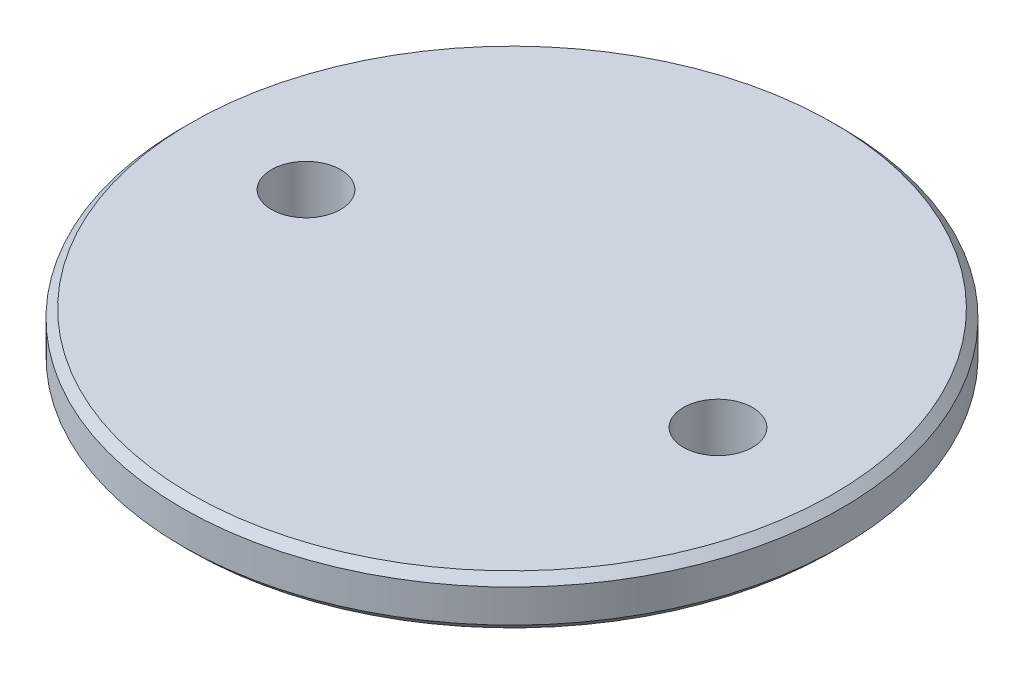
ISO-10303-21;
HEADER;
FILE_DESCRIPTION(('STEP AP214'),'2;1');
FILE_NAME('part.step','',(''),(''),'','','');
FILE_SCHEMA(('AUTOMOTIVE_DESIGN { 1 0 10303 214 1 1 1 1 }'));
ENDSEC;
DATA;
#1=APPLICATION_CONTEXT('core data for automotive mechanical design processes');
#2=APPLICATION_PROTOCOL_DEFINITION('international standard','automotive_design',2000,#1);
#3=PRODUCT_CONTEXT('',#1,'mechanical');
#4=PRODUCT('Part','Part','',(#3));
#5=PRODUCT_RELATED_PRODUCT_CATEGORY('part','',(#4));
#6=PRODUCT_DEFINITION_FORMATION('','',#4);
#7=PRODUCT_DEFINITION_CONTEXT('part definition',#1,'design');
#8=PRODUCT_DEFINITION('design','',#6,#7);
#9=PRODUCT_DEFINITION_SHAPE('','',#8);
#10=(LENGTH_UNIT() NAMED_UNIT(*) SI_UNIT(.MILLI.,.METRE.));
#11=(NAMED_UNIT(*) PLANE_ANGLE_UNIT() SI_UNIT($,.RADIAN.));
#12=(NAMED_UNIT(*) SI_UNIT($,.STERADIAN.) SOLID_ANGLE_UNIT());
#13=UNCERTAINTY_MEASURE_WITH_UNIT(LENGTH_MEASURE(1.E-05),#10,'distance_accuracy_value','');
#14=(GEOMETRIC_REPRESENTATION_CONTEXT(3) GLOBAL_UNCERTAINTY_ASSIGNED_CONTEXT((#13)) GLOBAL_UNIT_ASSIGNED_CONTEXT((#10,
#11,#12)) REPRESENTATION_CONTEXT('',''));
#15=CARTESIAN_POINT('',(0.,0.,0.));
#16=DIRECTION('',(0.,0.,1.));
#17=DIRECTION('',(1.,0.,0.));
#18=AXIS2_PLACEMENT_3D('',#15,#16,#17);
#19=CARTESIAN_POINT('',(0.,3.,0.));
#20=DIRECTION('',(0.,-1.,0.));
#21=DIRECTION('',(0.,0.,-1.));
#22=AXIS2_PLACEMENT_3D('',#19,#20,#21);
#23=CYLINDRICAL_SURFACE('',#22,20.);
#24=CARTESIAN_POINT('',(0.,0.5,0.));
#25=DIRECTION('',(0.,1.,0.));
#26=DIRECTION('',(0.,0.,1.));
#27=AXIS2_PLACEMENT_3D('',#24,#25,#26);
#28=CIRCLE('',#27,20.);
#29=CARTESIAN_POINT('',(0.,0.5,20.));
#30=VERTEX_POINT('',#29);
#31=EDGE_CURVE('E27',#30,#30,#28,.T.);
#32=ORIENTED_EDGE('',*,*,#31,.T.);
#33=EDGE_LOOP('',(#32));
#34=FACE_BOUND('',#33,.T.);
#35=CARTESIAN_POINT('',(0.,2.5,0.));
#36=DIRECTION('',(0.,1.,0.));
#37=DIRECTION('',(0.,0.,1.));
#38=AXIS2_PLACEMENT_3D('',#35,#36,#37);
#39=CIRCLE('',#38,20.);
#40=CARTESIAN_POINT('',(0.,2.5,20.));
#41=VERTEX_POINT('',#40);
#42=EDGE_CURVE('E31',#41,#41,#39,.F.);
#43=ORIENTED_EDGE('',*,*,#42,.T.);
#44=EDGE_LOOP('',(#43));
#45=FACE_BOUND('',#44,.T.);
#46=ADVANCED_FACE('F15',(#34,#45),#23,.T.);
#47=CARTESIAN_POINT('',(0.,3.,0.));
#48=DIRECTION('',(0.,1.,0.));
#49=DIRECTION('',(0.,0.,1.));
#50=AXIS2_PLACEMENT_3D('',#47,#48,#49);
#51=PLANE('',#50);
#52=CARTESIAN_POINT('',(0.,3.,0.));
#53=DIRECTION('',(0.,1.,0.));
#54=DIRECTION('',(0.,0.,1.));
#55=AXIS2_PLACEMENT_3D('',#52,#53,#54);
#56=CIRCLE('',#55,19.5);
#57=CARTESIAN_POINT('',(0.,3.,19.5));
#58=VERTEX_POINT('',#57);
#59=EDGE_CURVE('E10',#58,#58,#56,.T.);
#60=ORIENTED_EDGE('',*,*,#59,.T.);
#61=EDGE_LOOP('',(#60));
#62=FACE_BOUND('',#61,.T.);
#63=CARTESIAN_POINT('',(12.5,3.,0.));
#64=DIRECTION('',(0.,1.,0.));
#65=DIRECTION('',(0.,0.,1.));
#66=AXIS2_PLACEMENT_3D('',#63,#64,#65);
#67=CIRCLE('',#66,2.1);
#68=CARTESIAN_POINT('',(12.5,3.,2.1));
#69=VERTEX_POINT('',#68);
#70=EDGE_CURVE('E45',#69,#69,#67,.T.);
#71=ORIENTED_EDGE('',*,*,#70,.F.);
#72=EDGE_LOOP('',(#71));
#73=FACE_BOUND('',#72,.T.);
#74=CARTESIAN_POINT('',(-12.5,3.,0.));
#75=DIRECTION('',(0.,1.,0.));
#76=DIRECTION('',(0.,0.,1.));
#77=AXIS2_PLACEMENT_3D('',#74,#75,#76);
#78=CIRCLE('',#77,2.1);
#79=CARTESIAN_POINT('',(-12.5,3.,2.1));
#80=VERTEX_POINT('',#79);
#81=EDGE_CURVE('E39',#80,#80,#78,.T.);
#82=ORIENTED_EDGE('',*,*,#81,.F.);
#83=EDGE_LOOP('',(#82));
#84=FACE_BOUND('',#83,.T.);
#85=ADVANCED_FACE('F51',(#62,#73,#84),#51,.T.);
#86=CARTESIAN_POINT('',(0.,0.,0.));
#87=DIRECTION('',(0.,1.,0.));
#88=DIRECTION('',(0.,0.,1.));
#89=AXIS2_PLACEMENT_3D('',#86,#87,#88);
#90=PLANE('',#89);
#91=CARTESIAN_POINT('',(0.,0.,0.));
#92=DIRECTION('',(0.,1.,0.));
#93=DIRECTION('',(0.,0.,1.));
#94=AXIS2_PLACEMENT_3D('',#91,#92,#93);
#95=CIRCLE('',#94,19.5);
#96=CARTESIAN_POINT('',(0.,0.,19.5));
#97=VERTEX_POINT('',#96);
#98=EDGE_CURVE('E23',#97,#97,#95,.F.);
#99=ORIENTED_EDGE('',*,*,#98,.T.);
#100=EDGE_LOOP('',(#99));
#101=FACE_BOUND('',#100,.T.);
#102=CARTESIAN_POINT('',(12.5,0.,0.));
#103=DIRECTION('',(0.,1.,0.));
#104=DIRECTION('',(0.,0.,1.));
#105=AXIS2_PLACEMENT_3D('',#102,#103,#104);
#106=CIRCLE('',#105,2.1);
#107=CARTESIAN_POINT('',(12.5,0.,2.1));
#108=VERTEX_POINT('',#107);
#109=EDGE_CURVE('E42',#108,#108,#106,.T.);
#110=ORIENTED_EDGE('',*,*,#109,.T.);
#111=EDGE_LOOP('',(#110));
#112=FACE_BOUND('',#111,.T.);
#113=CARTESIAN_POINT('',(-12.5,0.,0.));
#114=DIRECTION('',(0.,1.,0.));
#115=DIRECTION('',(0.,0.,1.));
#116=AXIS2_PLACEMENT_3D('',#113,#114,#115);
#117=CIRCLE('',#116,2.1);
#118=CARTESIAN_POINT('',(-12.5,0.,2.1));
#119=VERTEX_POINT('',#118);
#120=EDGE_CURVE('E36',#119,#119,#117,.T.);
#121=ORIENTED_EDGE('',*,*,#120,.T.);
#122=EDGE_LOOP('',(#121));
#123=FACE_BOUND('',#122,.T.);
#124=ADVANCED_FACE('F54',(#101,#112,#123),#90,.F.);
#125=CARTESIAN_POINT('',(-12.5,3.,0.));
#126=DIRECTION('',(0.,1.,0.));
#127=DIRECTION('',(0.,0.,1.));
#128=AXIS2_PLACEMENT_3D('',#125,#126,#127);
#129=CYLINDRICAL_SURFACE('',#128,2.1);
#130=ORIENTED_EDGE('',*,*,#120,.F.);
#131=EDGE_LOOP('',(#130));
#132=FACE_BOUND('',#131,.T.);
#133=ORIENTED_EDGE('',*,*,#81,.T.);
#134=EDGE_LOOP('',(#133));
#135=FACE_BOUND('',#134,.T.);
#136=ADVANCED_FACE('F58',(#132,#135),#129,.F.);
#137=CARTESIAN_POINT('',(12.5,3.,0.));
#138=DIRECTION('',(0.,1.,0.));
#139=DIRECTION('',(0.,0.,1.));
#140=AXIS2_PLACEMENT_3D('',#137,#138,#139);
#141=CYLINDRICAL_SURFACE('',#140,2.1);
#142=ORIENTED_EDGE('',*,*,#109,.F.);
#143=EDGE_LOOP('',(#142));
#144=FACE_BOUND('',#143,.T.);
#145=ORIENTED_EDGE('',*,*,#70,.T.);
#146=EDGE_LOOP('',(#145));
#147=FACE_BOUND('',#146,.T.);
#148=ADVANCED_FACE('F49',(#144,#147),#141,.F.);
#149=CARTESIAN_POINT('',(0.,0.5,0.));
#150=DIRECTION('',(0.,1.,0.));
#151=DIRECTION('',(0.,0.,1.));
#152=AXIS2_PLACEMENT_3D('',#149,#150,#151);
#153=CONICAL_SURFACE('',#152,20.,0.785398163397452);
#154=ORIENTED_EDGE('',*,*,#98,.F.);
#155=EDGE_LOOP('',(#154));
#156=FACE_BOUND('',#155,.T.);
#157=ORIENTED_EDGE('',*,*,#31,.F.);
#158=EDGE_LOOP('',(#157));
#159=FACE_BOUND('',#158,.T.);
#160=ADVANCED_FACE('F68',(#156,#159),#153,.T.);
#161=CARTESIAN_POINT('',(0.,3.,0.));
#162=DIRECTION('',(0.,-1.,0.));
#163=DIRECTION('',(0.,0.,-1.));
#164=AXIS2_PLACEMENT_3D('',#161,#162,#163);
#165=CONICAL_SURFACE('',#164,19.5,0.785398163397441);
#166=ORIENTED_EDGE('',*,*,#42,.F.);
#167=EDGE_LOOP('',(#166));
#168=FACE_BOUND('',#167,.T.);
#169=ORIENTED_EDGE('',*,*,#59,.F.);
#170=EDGE_LOOP('',(#169));
#171=FACE_BOUND('',#170,.T.);
#172=ADVANCED_FACE('F18',(#168,#171),#165,.T.);
#173=CLOSED_SHELL('',(#46,#85,#124,#136,#148,#160,#172));
#174=MANIFOLD_SOLID_BREP('B1',#173);
#175=ADVANCED_BREP_SHAPE_REPRESENTATION('',(#18,#174),#14);
#176=SHAPE_DEFINITION_REPRESENTATION(#9,#175);
ENDSEC;
END-ISO-10303-21;
